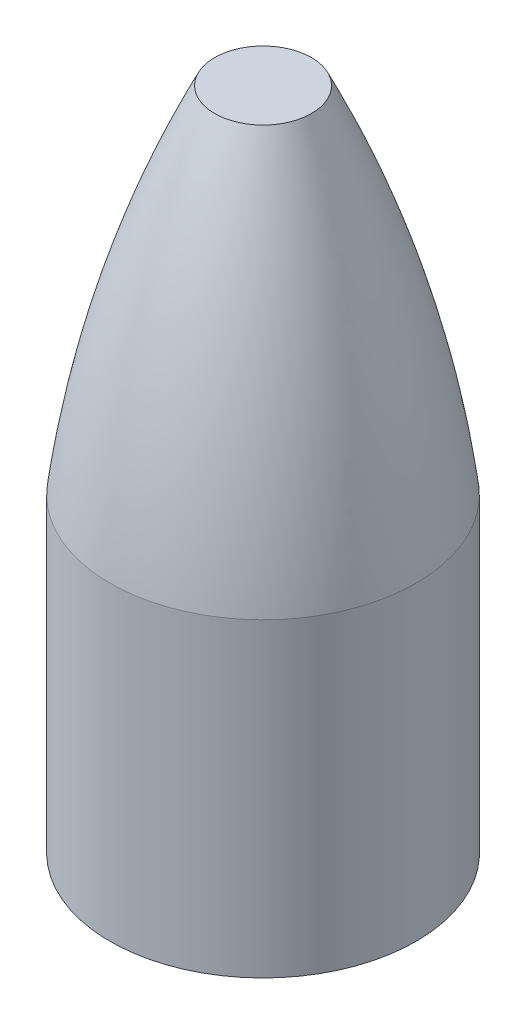
ISO-10303-21;
HEADER;
FILE_DESCRIPTION(('STEP AP214'),'2;1');
FILE_NAME('part.step','',(''),(''),'','','');
FILE_SCHEMA(('AUTOMOTIVE_DESIGN { 1 0 10303 214 1 1 1 1 }'));
ENDSEC;
DATA;
#1=APPLICATION_CONTEXT('core data for automotive mechanical design processes');
#2=APPLICATION_PROTOCOL_DEFINITION('international standard','automotive_design',2000,#1);
#3=PRODUCT_CONTEXT('',#1,'mechanical');
#4=PRODUCT('Part','Part','',(#3));
#5=PRODUCT_RELATED_PRODUCT_CATEGORY('part','',(#4));
#6=PRODUCT_DEFINITION_FORMATION('','',#4);
#7=PRODUCT_DEFINITION_CONTEXT('part definition',#1,'design');
#8=PRODUCT_DEFINITION('design','',#6,#7);
#9=PRODUCT_DEFINITION_SHAPE('','',#8);
#10=(LENGTH_UNIT() NAMED_UNIT(*) SI_UNIT(.MILLI.,.METRE.));
#11=(NAMED_UNIT(*) PLANE_ANGLE_UNIT() SI_UNIT($,.RADIAN.));
#12=(NAMED_UNIT(*) SI_UNIT($,.STERADIAN.) SOLID_ANGLE_UNIT());
#13=UNCERTAINTY_MEASURE_WITH_UNIT(LENGTH_MEASURE(1.E-05),#10,'distance_accuracy_value','');
#14=(GEOMETRIC_REPRESENTATION_CONTEXT(3) GLOBAL_UNCERTAINTY_ASSIGNED_CONTEXT((#13)) GLOBAL_UNIT_ASSIGNED_CONTEXT((#10,
#11,#12)) REPRESENTATION_CONTEXT('',''));
#15=CARTESIAN_POINT('',(0.,0.,0.));
#16=DIRECTION('',(0.,0.,1.));
#17=DIRECTION('',(1.,0.,0.));
#18=AXIS2_PLACEMENT_3D('',#15,#16,#17);
#19=CARTESIAN_POINT('',(0.,0.,0.));
#20=DIRECTION('',(0.,1.,0.));
#21=DIRECTION('',(0.,0.,1.));
#22=AXIS2_PLACEMENT_3D('',#19,#20,#21);
#23=PLANE('',#22);
#24=CARTESIAN_POINT('',(0.,0.,0.));
#25=DIRECTION('',(0.,1.,0.));
#26=DIRECTION('',(0.,0.,1.));
#27=AXIS2_PLACEMENT_3D('',#24,#25,#26);
#28=CIRCLE('',#27,2279.65);
#29=CARTESIAN_POINT('',(0.,0.,2279.65));
#30=VERTEX_POINT('',#29);
#31=EDGE_CURVE('E45',#30,#30,#28,.F.);
#32=ORIENTED_EDGE('',*,*,#31,.F.);
#33=EDGE_LOOP('',(#32));
#34=FACE_BOUND('',#33,.T.);
#35=CARTESIAN_POINT('',(0.,0.,0.));
#36=DIRECTION('',(0.,-1.,0.));
#37=DIRECTION('',(0.,0.,-1.));
#38=AXIS2_PLACEMENT_3D('',#35,#36,#37);
#39=CIRCLE('',#38,2286.);
#40=CARTESIAN_POINT('',(0.,0.,-2286.));
#41=VERTEX_POINT('',#40);
#42=EDGE_CURVE('E10',#41,#41,#39,.T.);
#43=ORIENTED_EDGE('',*,*,#42,.T.);
#44=EDGE_LOOP('',(#43));
#45=FACE_BOUND('',#44,.T.);
#46=ADVANCED_FACE('F31',(#34,#45),#23,.F.);
#47=CARTESIAN_POINT('',(0.,0.,0.));
#48=DIRECTION('',(0.,-1.,0.));
#49=DIRECTION('',(0.,0.,-1.));
#50=AXIS2_PLACEMENT_3D('',#47,#48,#49);
#51=CYLINDRICAL_SURFACE('',#50,2286.);
#52=ORIENTED_EDGE('',*,*,#42,.F.);
#53=EDGE_LOOP('',(#52));
#54=FACE_BOUND('',#53,.T.);
#55=CARTESIAN_POINT('',(0.,4634.23,0.));
#56=DIRECTION('',(0.,-1.,0.));
#57=DIRECTION('',(0.,0.,-1.));
#58=AXIS2_PLACEMENT_3D('',#55,#56,#57);
#59=CIRCLE('',#58,2286.);
#60=CARTESIAN_POINT('',(0.,4634.23,-2286.));
#61=VERTEX_POINT('',#60);
#62=EDGE_CURVE('E37',#61,#61,#59,.T.);
#63=ORIENTED_EDGE('',*,*,#62,.T.);
#64=EDGE_LOOP('',(#63));
#65=FACE_BOUND('',#64,.T.);
#66=ADVANCED_FACE('F63',(#54,#65),#51,.T.);
#67=CARTESIAN_POINT('',(-723.9,9930.13,0.));
#68=CARTESIAN_POINT('',(-1132.19176489554,9076.79636663276,0.));
#69=CARTESIAN_POINT('',(-1796.40227217122,7345.15083587871,0.));
#70=CARTESIAN_POINT('',(-2174.47248021186,5529.82383038281,0.));
#71=CARTESIAN_POINT('',(-2286.,4634.23,0.));
#72=B_SPLINE_CURVE_WITH_KNOTS('',3,(#67,#68,#69,#70,#71),.UNSPECIFIED.,.F.,.F.,(4,1,4),(0.,
0.511780427837637,1.),.UNSPECIFIED.);
#73=CARTESIAN_POINT('',(0.,0.,0.));
#74=DIRECTION('',(0.,-1.,0.));
#75=AXIS1_PLACEMENT('',#73,#74);
#76=SURFACE_OF_REVOLUTION('',#72,#75);
#77=ORIENTED_EDGE('',*,*,#62,.F.);
#78=EDGE_LOOP('',(#77));
#79=FACE_BOUND('',#78,.T.);
#80=CARTESIAN_POINT('',(0.,9930.13,0.));
#81=DIRECTION('',(0.,-1.,0.));
#82=DIRECTION('',(0.,0.,-1.));
#83=AXIS2_PLACEMENT_3D('',#80,#81,#82);
#84=CIRCLE('',#83,723.9);
#85=CARTESIAN_POINT('',(0.,9930.13,-723.9));
#86=VERTEX_POINT('',#85);
#87=EDGE_CURVE('E41',#86,#86,#84,.T.);
#88=ORIENTED_EDGE('',*,*,#87,.T.);
#89=EDGE_LOOP('',(#88));
#90=FACE_BOUND('',#89,.T.);
#91=ADVANCED_FACE('F57',(#79,#90),#76,.T.);
#92=CARTESIAN_POINT('',(0.,9930.13,0.));
#93=DIRECTION('',(0.,-1.,0.));
#94=DIRECTION('',(0.,0.,-1.));
#95=AXIS2_PLACEMENT_3D('',#92,#93,#94);
#96=PLANE('',#95);
#97=ORIENTED_EDGE('',*,*,#87,.F.);
#98=EDGE_LOOP('',(#97));
#99=FACE_BOUND('',#98,.T.);
#100=ADVANCED_FACE('F62',(#99),#96,.F.);
#101=CARTESIAN_POINT('',(0.,0.,0.));
#102=DIRECTION('',(0.,-1.,0.));
#103=DIRECTION('',(0.,0.,-1.));
#104=AXIS2_PLACEMENT_3D('',#101,#102,#103);
#105=CYLINDRICAL_SURFACE('',#104,2279.65);
#106=ORIENTED_EDGE('',*,*,#31,.T.);
#107=EDGE_LOOP('',(#106));
#108=FACE_BOUND('',#107,.T.);
#109=CARTESIAN_POINT('',(0.,4633.83610324276,0.));
#110=DIRECTION('',(0.,-1.,0.));
#111=DIRECTION('',(0.,0.,-1.));
#112=AXIS2_PLACEMENT_3D('',#109,#110,#111);
#113=CIRCLE('',#112,2279.65);
#114=CARTESIAN_POINT('',(0.,4633.83610324276,-2279.65));
#115=VERTEX_POINT('',#114);
#116=EDGE_CURVE('E85',#115,#115,#113,.T.);
#117=ORIENTED_EDGE('',*,*,#116,.F.);
#118=EDGE_LOOP('',(#117));
#119=FACE_BOUND('',#118,.T.);
#120=ADVANCED_FACE('F72',(#108,#119),#105,.F.);
#121=CARTESIAN_POINT('',(-723.9,9930.13,0.));
#122=CARTESIAN_POINT('',(-1132.19176489554,9076.79636663276,0.));
#123=CARTESIAN_POINT('',(-1796.40227217122,7345.15083587871,0.));
#124=CARTESIAN_POINT('',(-2174.47248021186,5529.82383038281,0.));
#125=CARTESIAN_POINT('',(-2286.,4634.23,0.));
#126=B_SPLINE_CURVE_WITH_KNOTS('',3,(#121,#122,#123,#124,#125),.UNSPECIFIED.,.F.,.F.,(4,1,4),
(0.,0.511780427837637,1.),.UNSPECIFIED.);
#127=CARTESIAN_POINT('',(0.,0.,0.));
#128=DIRECTION('',(0.,-1.,0.));
#129=AXIS1_PLACEMENT('',#127,#128);
#130=SURFACE_OF_REVOLUTION('',#126,#129);
#131=OFFSET_SURFACE('',#130,-6.35,.F.);
#132=ORIENTED_EDGE('',*,*,#116,.T.);
#133=EDGE_LOOP('',(#132));
#134=FACE_BOUND('',#133,.T.);
#135=CARTESIAN_POINT('',(0.,9923.78,0.));
#136=DIRECTION('',(0.,-1.,0.));
#137=DIRECTION('',(0.,0.,-1.));
#138=AXIS2_PLACEMENT_3D('',#135,#136,#137);
#139=CIRCLE('',#138,719.898334157661);
#140=CARTESIAN_POINT('',(0.,9923.78,-719.898334157661));
#141=VERTEX_POINT('',#140);
#142=EDGE_CURVE('E87',#141,#141,#139,.T.);
#143=ORIENTED_EDGE('',*,*,#142,.F.);
#144=EDGE_LOOP('',(#143));
#145=FACE_BOUND('',#144,.T.);
#146=ADVANCED_FACE('F65',(#134,#145),#131,.F.);
#147=CARTESIAN_POINT('',(0.,9923.78,0.));
#148=DIRECTION('',(0.,-1.,0.));
#149=DIRECTION('',(0.,0.,-1.));
#150=AXIS2_PLACEMENT_3D('',#147,#148,#149);
#151=PLANE('',#150);
#152=ORIENTED_EDGE('',*,*,#142,.T.);
#153=EDGE_LOOP('',(#152));
#154=FACE_BOUND('',#153,.T.);
#155=ADVANCED_FACE('F67',(#154),#151,.T.);
#156=CLOSED_SHELL('',(#46,#66,#91,#100,#120,#146,#155));
#157=MANIFOLD_SOLID_BREP('B2',#156);
#158=ADVANCED_BREP_SHAPE_REPRESENTATION('',(#18,#157),#14);
#159=SHAPE_DEFINITION_REPRESENTATION(#9,#158);
ENDSEC;
END-ISO-10303-21;
